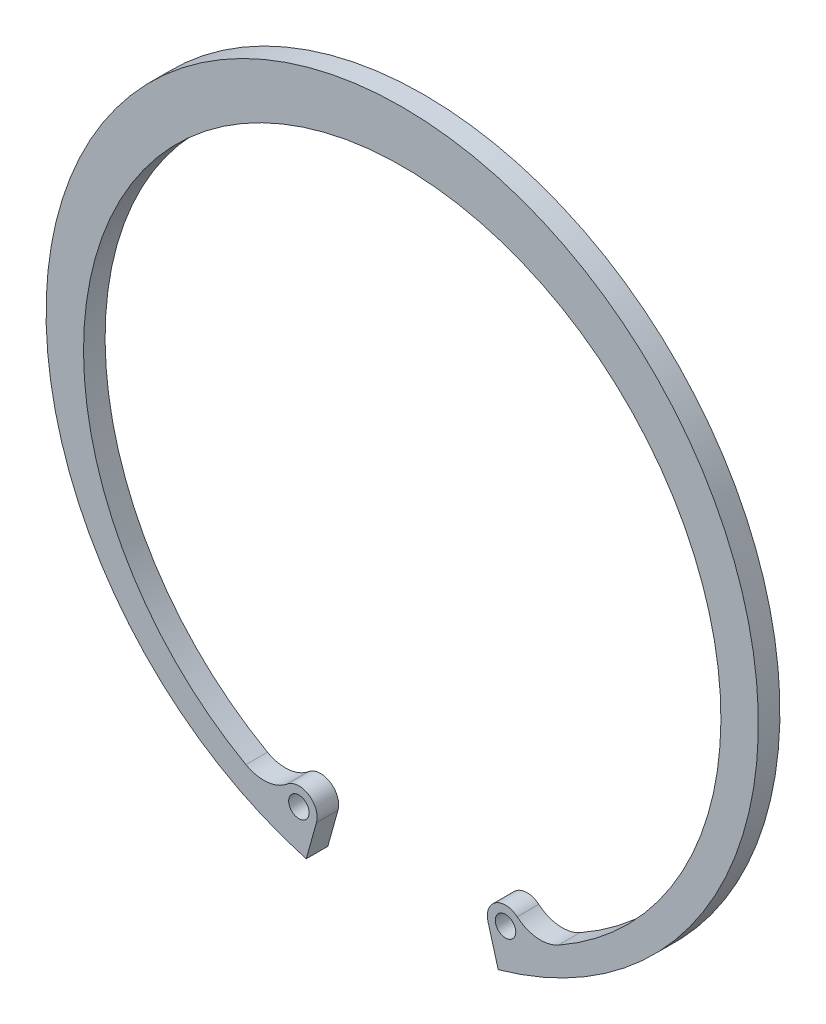
ISO-10303-21;
HEADER;
FILE_DESCRIPTION(('STEP AP214'),'2;1');
FILE_NAME('part.step','',(''),(''),'','','');
FILE_SCHEMA(('AUTOMOTIVE_DESIGN { 1 0 10303 214 1 1 1 1 }'));
ENDSEC;
DATA;
#1=APPLICATION_CONTEXT('core data for automotive mechanical design processes');
#2=APPLICATION_PROTOCOL_DEFINITION('international standard','automotive_design',2000,#1);
#3=PRODUCT_CONTEXT('',#1,'mechanical');
#4=PRODUCT('Part','Part','',(#3));
#5=PRODUCT_RELATED_PRODUCT_CATEGORY('part','',(#4));
#6=PRODUCT_DEFINITION_FORMATION('','',#4);
#7=PRODUCT_DEFINITION_CONTEXT('part definition',#1,'design');
#8=PRODUCT_DEFINITION('design','',#6,#7);
#9=PRODUCT_DEFINITION_SHAPE('','',#8);
#10=(LENGTH_UNIT() NAMED_UNIT(*) SI_UNIT(.MILLI.,.METRE.));
#11=(NAMED_UNIT(*) PLANE_ANGLE_UNIT() SI_UNIT($,.RADIAN.));
#12=(NAMED_UNIT(*) SI_UNIT($,.STERADIAN.) SOLID_ANGLE_UNIT());
#13=UNCERTAINTY_MEASURE_WITH_UNIT(LENGTH_MEASURE(1.E-05),#10,'distance_accuracy_value','');
#14=(GEOMETRIC_REPRESENTATION_CONTEXT(3) GLOBAL_UNCERTAINTY_ASSIGNED_CONTEXT((#13)) GLOBAL_UNIT_ASSIGNED_CONTEXT((#10,
#11,#12)) REPRESENTATION_CONTEXT('',''));
#15=CARTESIAN_POINT('',(0.,0.,0.));
#16=DIRECTION('',(0.,0.,1.));
#17=DIRECTION('',(1.,0.,0.));
#18=AXIS2_PLACEMENT_3D('',#15,#16,#17);
#19=CARTESIAN_POINT('',(0.,0.,4.));
#20=DIRECTION('',(0.,0.,1.));
#21=DIRECTION('',(1.,0.,0.));
#22=AXIS2_PLACEMENT_3D('',#19,#20,#21);
#23=PLANE('',#22);
#24=CARTESIAN_POINT('',(19.1596659550051,-55.9345405406411,4.));
#25=DIRECTION('',(0.,0.,1.));
#26=DIRECTION('',(1.,0.,0.));
#27=AXIS2_PLACEMENT_3D('',#24,#25,#26);
#28=CIRCLE('',#27,1.9);
#29=CARTESIAN_POINT('',(21.0596659550051,-55.9345405406411,4.));
#30=VERTEX_POINT('',#29);
#31=EDGE_CURVE('E142',#30,#30,#28,.T.);
#32=ORIENTED_EDGE('',*,*,#31,.F.);
#33=EDGE_LOOP('',(#32));
#34=FACE_BOUND('',#33,.T.);
#35=CARTESIAN_POINT('',(0.,0.,4.));
#36=DIRECTION('',(0.,0.,1.));
#37=DIRECTION('',(1.,0.,0.));
#38=AXIS2_PLACEMENT_3D('',#35,#36,#37);
#39=CIRCLE('',#38,66.05);
#40=CARTESIAN_POINT('',(17.8019912144038,-63.6057513814772,4.));
#41=VERTEX_POINT('',#40);
#42=CARTESIAN_POINT('',(-17.8019912144038,-63.6057513814772,4.));
#43=VERTEX_POINT('',#42);
#44=EDGE_CURVE('E153',#41,#43,#39,.T.);
#45=ORIENTED_EDGE('',*,*,#44,.T.);
#46=DIRECTION('',(0.269522955554942,0.962993964897459,0.));
#47=VECTOR('',#46,1.);
#48=CARTESIAN_POINT('',(-17.8019912144038,-63.6057513814772,4.));
#49=LINE('',#48,#47);
#50=CARTESIAN_POINT('',(-15.9095613234761,-56.844180515639,4.));
#51=VERTEX_POINT('',#50);
#52=EDGE_CURVE('E101',#43,#51,#49,.T.);
#53=ORIENTED_EDGE('',*,*,#52,.T.);
#54=CARTESIAN_POINT('',(-19.1596659550051,-55.9345405406411,4.));
#55=DIRECTION('',(0.,0.,1.));
#56=DIRECTION('',(1.,0.,0.));
#57=AXIS2_PLACEMENT_3D('',#54,#55,#56);
#58=CIRCLE('',#57,3.375);
#59=CARTESIAN_POINT('',(-21.3315807731446,-53.3512459343783,4.));
#60=VERTEX_POINT('',#59);
#61=EDGE_CURVE('E168',#51,#60,#58,.T.);
#62=ORIENTED_EDGE('',*,*,#61,.T.);
#63=CARTESIAN_POINT('',(-25.6754104094235,-48.1846567218529,4.));
#64=DIRECTION('',(0.,0.,-1.));
#65=DIRECTION('',(1.,0.,0.));
#66=AXIS2_PLACEMENT_3D('',#63,#64,#65);
#67=CIRCLE('',#66,6.75000000000001);
#68=CARTESIAN_POINT('',(-28.9855977996206,-54.0672717391543,4.));
#69=VERTEX_POINT('',#68);
#70=EDGE_CURVE('E181',#60,#69,#67,.T.);
#71=ORIENTED_EDGE('',*,*,#70,.T.);
#72=CARTESIAN_POINT('',(0.,-2.55625656023456,4.));
#73=DIRECTION('',(0.,0.,-1.));
#74=DIRECTION('',(1.,0.,0.));
#75=AXIS2_PLACEMENT_3D('',#72,#73,#74);
#76=CIRCLE('',#75,59.1062565602346);
#77=CARTESIAN_POINT('',(28.9855977996205,-54.0672717391543,4.));
#78=VERTEX_POINT('',#77);
#79=EDGE_CURVE('E120',#69,#78,#76,.T.);
#80=ORIENTED_EDGE('',*,*,#79,.T.);
#81=CARTESIAN_POINT('',(25.6754104094235,-48.1846567218529,4.));
#82=DIRECTION('',(0.,0.,-1.));
#83=DIRECTION('',(1.,0.,0.));
#84=AXIS2_PLACEMENT_3D('',#81,#82,#83);
#85=CIRCLE('',#84,6.75000000000001);
#86=CARTESIAN_POINT('',(21.3315807731446,-53.3512459343783,4.));
#87=VERTEX_POINT('',#86);
#88=EDGE_CURVE('E114',#78,#87,#85,.T.);
#89=ORIENTED_EDGE('',*,*,#88,.T.);
#90=CARTESIAN_POINT('',(19.1596659550051,-55.9345405406411,4.));
#91=DIRECTION('',(0.,0.,1.));
#92=DIRECTION('',(1.,0.,0.));
#93=AXIS2_PLACEMENT_3D('',#90,#91,#92);
#94=CIRCLE('',#93,3.375);
#95=CARTESIAN_POINT('',(15.9095613234762,-56.844180515639,4.));
#96=VERTEX_POINT('',#95);
#97=EDGE_CURVE('E118',#87,#96,#94,.T.);
#98=ORIENTED_EDGE('',*,*,#97,.T.);
#99=DIRECTION('',(0.269522955554941,-0.962993964897459,0.));
#100=VECTOR('',#99,1.);
#101=CARTESIAN_POINT('',(17.8019912144038,-63.6057513814772,4.));
#102=LINE('',#101,#100);
#103=EDGE_CURVE('E58',#96,#41,#102,.T.);
#104=ORIENTED_EDGE('',*,*,#103,.T.);
#105=EDGE_LOOP('',(#45,#53,#62,#71,#80,#89,#98,#104));
#106=FACE_BOUND('',#105,.T.);
#107=CARTESIAN_POINT('',(-19.1596659550051,-55.9345405406411,4.));
#108=DIRECTION('',(0.,0.,1.));
#109=DIRECTION('',(1.,0.,0.));
#110=AXIS2_PLACEMENT_3D('',#107,#108,#109);
#111=CIRCLE('',#110,1.9);
#112=CARTESIAN_POINT('',(-17.2596659550051,-55.9345405406411,4.));
#113=VERTEX_POINT('',#112);
#114=EDGE_CURVE('E190',#113,#113,#111,.T.);
#115=ORIENTED_EDGE('',*,*,#114,.F.);
#116=EDGE_LOOP('',(#115));
#117=FACE_BOUND('',#116,.T.);
#118=ADVANCED_FACE('F41',(#34,#106,#117),#23,.T.);
#119=CARTESIAN_POINT('',(0.,0.,0.));
#120=DIRECTION('',(0.,0.,1.));
#121=DIRECTION('',(1.,0.,0.));
#122=AXIS2_PLACEMENT_3D('',#119,#120,#121);
#123=PLANE('',#122);
#124=CARTESIAN_POINT('',(0.,0.,0.));
#125=DIRECTION('',(0.,0.,1.));
#126=DIRECTION('',(1.,0.,0.));
#127=AXIS2_PLACEMENT_3D('',#124,#125,#126);
#128=CIRCLE('',#127,66.05);
#129=CARTESIAN_POINT('',(17.8019912144038,-63.6057513814772,0.));
#130=VERTEX_POINT('',#129);
#131=CARTESIAN_POINT('',(-17.8019912144038,-63.6057513814772,0.));
#132=VERTEX_POINT('',#131);
#133=EDGE_CURVE('E138',#130,#132,#128,.T.);
#134=ORIENTED_EDGE('',*,*,#133,.F.);
#135=DIRECTION('',(0.269522955554941,-0.962993964897459,0.));
#136=VECTOR('',#135,1.);
#137=CARTESIAN_POINT('',(17.8019912144038,-63.6057513814772,0.));
#138=LINE('',#137,#136);
#139=CARTESIAN_POINT('',(15.9095613234762,-56.844180515639,0.));
#140=VERTEX_POINT('',#139);
#141=EDGE_CURVE('E93',#140,#130,#138,.T.);
#142=ORIENTED_EDGE('',*,*,#141,.F.);
#143=CARTESIAN_POINT('',(19.1596659550051,-55.9345405406411,0.));
#144=DIRECTION('',(0.,0.,1.));
#145=DIRECTION('',(1.,0.,0.));
#146=AXIS2_PLACEMENT_3D('',#143,#144,#145);
#147=CIRCLE('',#146,3.375);
#148=CARTESIAN_POINT('',(21.3315807731446,-53.3512459343783,0.));
#149=VERTEX_POINT('',#148);
#150=EDGE_CURVE('E87',#149,#140,#147,.T.);
#151=ORIENTED_EDGE('',*,*,#150,.F.);
#152=CARTESIAN_POINT('',(25.6754104094235,-48.1846567218529,0.));
#153=DIRECTION('',(0.,0.,-1.));
#154=DIRECTION('',(1.,0.,0.));
#155=AXIS2_PLACEMENT_3D('',#152,#153,#154);
#156=CIRCLE('',#155,6.75000000000001);
#157=CARTESIAN_POINT('',(28.9855977996205,-54.0672717391543,0.));
#158=VERTEX_POINT('',#157);
#159=EDGE_CURVE('E128',#158,#149,#156,.T.);
#160=ORIENTED_EDGE('',*,*,#159,.F.);
#161=CARTESIAN_POINT('',(0.,-2.55625656023456,0.));
#162=DIRECTION('',(0.,0.,-1.));
#163=DIRECTION('',(1.,0.,0.));
#164=AXIS2_PLACEMENT_3D('',#161,#162,#163);
#165=CIRCLE('',#164,59.1062565602346);
#166=CARTESIAN_POINT('',(-28.9855977996206,-54.0672717391543,0.));
#167=VERTEX_POINT('',#166);
#168=EDGE_CURVE('E148',#167,#158,#165,.T.);
#169=ORIENTED_EDGE('',*,*,#168,.F.);
#170=CARTESIAN_POINT('',(-25.6754104094235,-48.1846567218529,0.));
#171=DIRECTION('',(0.,0.,-1.));
#172=DIRECTION('',(1.,0.,0.));
#173=AXIS2_PLACEMENT_3D('',#170,#171,#172);
#174=CIRCLE('',#173,6.75000000000001);
#175=CARTESIAN_POINT('',(-21.3315807731446,-53.3512459343783,0.));
#176=VERTEX_POINT('',#175);
#177=EDGE_CURVE('E146',#176,#167,#174,.T.);
#178=ORIENTED_EDGE('',*,*,#177,.F.);
#179=CARTESIAN_POINT('',(-19.1596659550051,-55.9345405406411,0.));
#180=DIRECTION('',(0.,0.,1.));
#181=DIRECTION('',(1.,0.,0.));
#182=AXIS2_PLACEMENT_3D('',#179,#180,#181);
#183=CIRCLE('',#182,3.375);
#184=CARTESIAN_POINT('',(-15.9095613234761,-56.844180515639,0.));
#185=VERTEX_POINT('',#184);
#186=EDGE_CURVE('E144',#185,#176,#183,.T.);
#187=ORIENTED_EDGE('',*,*,#186,.F.);
#188=DIRECTION('',(0.269522955554942,0.962993964897459,0.));
#189=VECTOR('',#188,1.);
#190=CARTESIAN_POINT('',(-17.8019912144038,-63.6057513814772,0.));
#191=LINE('',#190,#189);
#192=EDGE_CURVE('E141',#132,#185,#191,.T.);
#193=ORIENTED_EDGE('',*,*,#192,.F.);
#194=EDGE_LOOP('',(#134,#142,#151,#160,#169,#178,#187,#193));
#195=FACE_BOUND('',#194,.T.);
#196=CARTESIAN_POINT('',(19.1596659550051,-55.9345405406411,0.));
#197=DIRECTION('',(0.,0.,1.));
#198=DIRECTION('',(1.,0.,0.));
#199=AXIS2_PLACEMENT_3D('',#196,#197,#198);
#200=CIRCLE('',#199,1.9);
#201=CARTESIAN_POINT('',(21.0596659550051,-55.9345405406411,0.));
#202=VERTEX_POINT('',#201);
#203=EDGE_CURVE('E187',#202,#202,#200,.T.);
#204=ORIENTED_EDGE('',*,*,#203,.T.);
#205=EDGE_LOOP('',(#204));
#206=FACE_BOUND('',#205,.T.);
#207=CARTESIAN_POINT('',(-19.1596659550051,-55.9345405406411,0.));
#208=DIRECTION('',(0.,0.,1.));
#209=DIRECTION('',(1.,0.,0.));
#210=AXIS2_PLACEMENT_3D('',#207,#208,#209);
#211=CIRCLE('',#210,1.9);
#212=CARTESIAN_POINT('',(-17.2596659550051,-55.9345405406411,0.));
#213=VERTEX_POINT('',#212);
#214=EDGE_CURVE('E193',#213,#213,#211,.T.);
#215=ORIENTED_EDGE('',*,*,#214,.T.);
#216=EDGE_LOOP('',(#215));
#217=FACE_BOUND('',#216,.T.);
#218=ADVANCED_FACE('F172',(#195,#206,#217),#123,.F.);
#219=CARTESIAN_POINT('',(0.,0.,4.));
#220=DIRECTION('',(0.,0.,-1.));
#221=DIRECTION('',(-1.,0.,0.));
#222=AXIS2_PLACEMENT_3D('',#219,#220,#221);
#223=CYLINDRICAL_SURFACE('',#222,66.05);
#224=ORIENTED_EDGE('',*,*,#133,.T.);
#225=DIRECTION('',(0.,0.,-1.));
#226=VECTOR('',#225,1.);
#227=CARTESIAN_POINT('',(-17.8019912144038,-63.6057513814772,4.));
#228=LINE('',#227,#226);
#229=EDGE_CURVE('E11',#43,#132,#228,.T.);
#230=ORIENTED_EDGE('',*,*,#229,.F.);
#231=ORIENTED_EDGE('',*,*,#44,.F.);
#232=DIRECTION('',(0.,0.,-1.));
#233=VECTOR('',#232,1.);
#234=CARTESIAN_POINT('',(17.8019912144038,-63.6057513814772,4.));
#235=LINE('',#234,#233);
#236=EDGE_CURVE('E134',#41,#130,#235,.T.);
#237=ORIENTED_EDGE('',*,*,#236,.T.);
#238=EDGE_LOOP('',(#224,#230,#231,#237));
#239=FACE_BOUND('',#238,.T.);
#240=ADVANCED_FACE('F43',(#239),#223,.T.);
#241=CARTESIAN_POINT('',(-17.8019912144038,-63.6057513814772,4.));
#242=DIRECTION('',(-0.962993964897459,0.269522955554942,0.));
#243=DIRECTION('',(-0.269522955554942,-0.962993964897459,0.));
#244=AXIS2_PLACEMENT_3D('',#241,#242,#243);
#245=PLANE('',#244);
#246=ORIENTED_EDGE('',*,*,#192,.T.);
#247=DIRECTION('',(0.,0.,-1.));
#248=VECTOR('',#247,1.);
#249=CARTESIAN_POINT('',(-15.9095613234761,-56.844180515639,4.));
#250=LINE('',#249,#248);
#251=EDGE_CURVE('E50',#51,#185,#250,.T.);
#252=ORIENTED_EDGE('',*,*,#251,.F.);
#253=ORIENTED_EDGE('',*,*,#52,.F.);
#254=ORIENTED_EDGE('',*,*,#229,.T.);
#255=EDGE_LOOP('',(#246,#252,#253,#254));
#256=FACE_BOUND('',#255,.T.);
#257=ADVANCED_FACE('F225',(#256),#245,.F.);
#258=CARTESIAN_POINT('',(-19.1596659550051,-55.9345405406411,4.));
#259=DIRECTION('',(0.,0.,-1.));
#260=DIRECTION('',(-1.,0.,0.));
#261=AXIS2_PLACEMENT_3D('',#258,#259,#260);
#262=CYLINDRICAL_SURFACE('',#261,3.375);
#263=ORIENTED_EDGE('',*,*,#186,.T.);
#264=DIRECTION('',(0.,0.,-1.));
#265=VECTOR('',#264,1.);
#266=CARTESIAN_POINT('',(-21.3315807731446,-53.3512459343783,4.));
#267=LINE('',#266,#265);
#268=EDGE_CURVE('E160',#60,#176,#267,.T.);
#269=ORIENTED_EDGE('',*,*,#268,.F.);
#270=ORIENTED_EDGE('',*,*,#61,.F.);
#271=ORIENTED_EDGE('',*,*,#251,.T.);
#272=EDGE_LOOP('',(#263,#269,#270,#271));
#273=FACE_BOUND('',#272,.T.);
#274=ADVANCED_FACE('F166',(#273),#262,.T.);
#275=CARTESIAN_POINT('',(-25.6754104094235,-48.1846567218529,4.));
#276=DIRECTION('',(0.,0.,-1.));
#277=DIRECTION('',(-1.,0.,0.));
#278=AXIS2_PLACEMENT_3D('',#275,#276,#277);
#279=CYLINDRICAL_SURFACE('',#278,6.75000000000001);
#280=ORIENTED_EDGE('',*,*,#177,.T.);
#281=DIRECTION('',(0.,0.,-1.));
#282=VECTOR('',#281,1.);
#283=CARTESIAN_POINT('',(-28.9855977996206,-54.0672717391543,4.));
#284=LINE('',#283,#282);
#285=EDGE_CURVE('E157',#69,#167,#284,.T.);
#286=ORIENTED_EDGE('',*,*,#285,.F.);
#287=ORIENTED_EDGE('',*,*,#70,.F.);
#288=ORIENTED_EDGE('',*,*,#268,.T.);
#289=EDGE_LOOP('',(#280,#286,#287,#288));
#290=FACE_BOUND('',#289,.T.);
#291=ADVANCED_FACE('F177',(#290),#279,.F.);
#292=CARTESIAN_POINT('',(0.,-2.55625656023456,4.));
#293=DIRECTION('',(0.,0.,-1.));
#294=DIRECTION('',(-1.,0.,0.));
#295=AXIS2_PLACEMENT_3D('',#292,#293,#294);
#296=CYLINDRICAL_SURFACE('',#295,59.1062565602346);
#297=ORIENTED_EDGE('',*,*,#168,.T.);
#298=DIRECTION('',(0.,0.,-1.));
#299=VECTOR('',#298,1.);
#300=CARTESIAN_POINT('',(28.9855977996205,-54.0672717391543,4.));
#301=LINE('',#300,#299);
#302=EDGE_CURVE('E129',#78,#158,#301,.T.);
#303=ORIENTED_EDGE('',*,*,#302,.F.);
#304=ORIENTED_EDGE('',*,*,#79,.F.);
#305=ORIENTED_EDGE('',*,*,#285,.T.);
#306=EDGE_LOOP('',(#297,#303,#304,#305));
#307=FACE_BOUND('',#306,.T.);
#308=ADVANCED_FACE('F180',(#307),#296,.F.);
#309=CARTESIAN_POINT('',(25.6754104094235,-48.1846567218529,4.));
#310=DIRECTION('',(0.,0.,-1.));
#311=DIRECTION('',(-1.,0.,0.));
#312=AXIS2_PLACEMENT_3D('',#309,#310,#311);
#313=CYLINDRICAL_SURFACE('',#312,6.75000000000001);
#314=ORIENTED_EDGE('',*,*,#159,.T.);
#315=DIRECTION('',(0.,0.,-1.));
#316=VECTOR('',#315,1.);
#317=CARTESIAN_POINT('',(21.3315807731446,-53.3512459343783,4.));
#318=LINE('',#317,#316);
#319=EDGE_CURVE('E125',#87,#149,#318,.T.);
#320=ORIENTED_EDGE('',*,*,#319,.F.);
#321=ORIENTED_EDGE('',*,*,#88,.F.);
#322=ORIENTED_EDGE('',*,*,#302,.T.);
#323=EDGE_LOOP('',(#314,#320,#321,#322));
#324=FACE_BOUND('',#323,.T.);
#325=ADVANCED_FACE('F126',(#324),#313,.F.);
#326=CARTESIAN_POINT('',(19.1596659550051,-55.9345405406411,4.));
#327=DIRECTION('',(0.,0.,-1.));
#328=DIRECTION('',(-1.,0.,0.));
#329=AXIS2_PLACEMENT_3D('',#326,#327,#328);
#330=CYLINDRICAL_SURFACE('',#329,3.375);
#331=ORIENTED_EDGE('',*,*,#150,.T.);
#332=DIRECTION('',(0.,0.,-1.));
#333=VECTOR('',#332,1.);
#334=CARTESIAN_POINT('',(15.9095613234762,-56.844180515639,4.));
#335=LINE('',#334,#333);
#336=EDGE_CURVE('E130',#96,#140,#335,.T.);
#337=ORIENTED_EDGE('',*,*,#336,.F.);
#338=ORIENTED_EDGE('',*,*,#97,.F.);
#339=ORIENTED_EDGE('',*,*,#319,.T.);
#340=EDGE_LOOP('',(#331,#337,#338,#339));
#341=FACE_BOUND('',#340,.T.);
#342=ADVANCED_FACE('F132',(#341),#330,.T.);
#343=CARTESIAN_POINT('',(17.8019912144038,-63.6057513814772,4.));
#344=DIRECTION('',(0.962993964897459,0.269522955554941,0.));
#345=DIRECTION('',(-0.269522955554941,0.962993964897459,0.));
#346=AXIS2_PLACEMENT_3D('',#343,#344,#345);
#347=PLANE('',#346);
#348=ORIENTED_EDGE('',*,*,#141,.T.);
#349=ORIENTED_EDGE('',*,*,#236,.F.);
#350=ORIENTED_EDGE('',*,*,#103,.F.);
#351=ORIENTED_EDGE('',*,*,#336,.T.);
#352=EDGE_LOOP('',(#348,#349,#350,#351));
#353=FACE_BOUND('',#352,.T.);
#354=ADVANCED_FACE('F213',(#353),#347,.F.);
#355=CARTESIAN_POINT('',(19.1596659550051,-55.9345405406411,4.));
#356=DIRECTION('',(0.,0.,-1.));
#357=DIRECTION('',(-1.,0.,0.));
#358=AXIS2_PLACEMENT_3D('',#355,#356,#357);
#359=CYLINDRICAL_SURFACE('',#358,1.9);
#360=ORIENTED_EDGE('',*,*,#31,.T.);
#361=EDGE_LOOP('',(#360));
#362=FACE_BOUND('',#361,.T.);
#363=ORIENTED_EDGE('',*,*,#203,.F.);
#364=EDGE_LOOP('',(#363));
#365=FACE_BOUND('',#364,.T.);
#366=ADVANCED_FACE('F210',(#362,#365),#359,.F.);
#367=CARTESIAN_POINT('',(-19.1596659550051,-55.9345405406411,4.));
#368=DIRECTION('',(0.,0.,-1.));
#369=DIRECTION('',(-1.,0.,0.));
#370=AXIS2_PLACEMENT_3D('',#367,#368,#369);
#371=CYLINDRICAL_SURFACE('',#370,1.9);
#372=ORIENTED_EDGE('',*,*,#114,.T.);
#373=EDGE_LOOP('',(#372));
#374=FACE_BOUND('',#373,.T.);
#375=ORIENTED_EDGE('',*,*,#214,.F.);
#376=EDGE_LOOP('',(#375));
#377=FACE_BOUND('',#376,.T.);
#378=ADVANCED_FACE('F199',(#374,#377),#371,.F.);
#379=CLOSED_SHELL('',(#118,#218,#240,#257,#274,#291,#308,#325,#342,#354,#366,#378));
#380=MANIFOLD_SOLID_BREP('B2',#379);
#381=ADVANCED_BREP_SHAPE_REPRESENTATION('',(#18,#380),#14);
#382=SHAPE_DEFINITION_REPRESENTATION(#9,#381);
ENDSEC;
END-ISO-10303-21;
